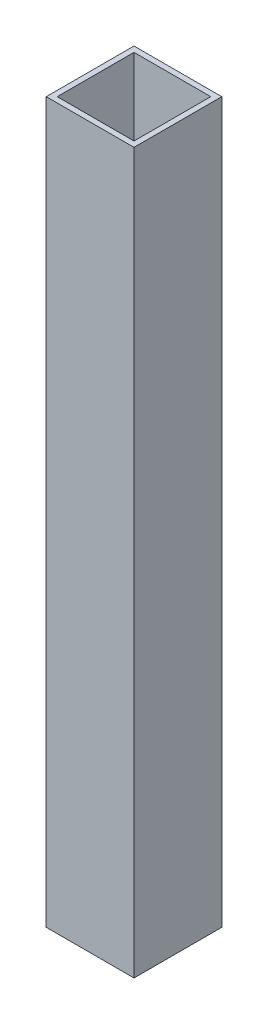
ISO-10303-21;
HEADER;
FILE_DESCRIPTION(('STEP AP214'),'2;1');
FILE_NAME('part.step','',(''),(''),'','','');
FILE_SCHEMA(('AUTOMOTIVE_DESIGN { 1 0 10303 214 1 1 1 1 }'));
ENDSEC;
DATA;
#1=APPLICATION_CONTEXT('core data for automotive mechanical design processes');
#2=APPLICATION_PROTOCOL_DEFINITION('international standard','automotive_design',2000,#1);
#3=PRODUCT_CONTEXT('',#1,'mechanical');
#4=PRODUCT('Part','Part','',(#3));
#5=PRODUCT_RELATED_PRODUCT_CATEGORY('part','',(#4));
#6=PRODUCT_DEFINITION_FORMATION('','',#4);
#7=PRODUCT_DEFINITION_CONTEXT('part definition',#1,'design');
#8=PRODUCT_DEFINITION('design','',#6,#7);
#9=PRODUCT_DEFINITION_SHAPE('','',#8);
#10=(LENGTH_UNIT() NAMED_UNIT(*) SI_UNIT(.MILLI.,.METRE.));
#11=(NAMED_UNIT(*) PLANE_ANGLE_UNIT() SI_UNIT($,.RADIAN.));
#12=(NAMED_UNIT(*) SI_UNIT($,.STERADIAN.) SOLID_ANGLE_UNIT());
#13=UNCERTAINTY_MEASURE_WITH_UNIT(LENGTH_MEASURE(1.E-05),#10,'distance_accuracy_value','');
#14=(GEOMETRIC_REPRESENTATION_CONTEXT(3) GLOBAL_UNCERTAINTY_ASSIGNED_CONTEXT((#13)) GLOBAL_UNIT_ASSIGNED_CONTEXT((#10,
#11,#12)) REPRESENTATION_CONTEXT('',''));
#15=CARTESIAN_POINT('',(0.,0.,0.));
#16=DIRECTION('',(0.,0.,1.));
#17=DIRECTION('',(1.,0.,0.));
#18=AXIS2_PLACEMENT_3D('',#15,#16,#17);
#19=CARTESIAN_POINT('',(0.,416.4076,0.));
#20=DIRECTION('',(0.,-1.,0.));
#21=DIRECTION('',(0.,0.,-1.));
#22=AXIS2_PLACEMENT_3D('',#19,#20,#21);
#23=PLANE('',#22);
#24=DIRECTION('',(0.,0.,-1.));
#25=VECTOR('',#24,1.);
#26=CARTESIAN_POINT('',(25.4,416.4076,25.4));
#27=LINE('',#26,#25);
#28=CARTESIAN_POINT('',(25.4,416.4076,25.4));
#29=VERTEX_POINT('',#28);
#30=CARTESIAN_POINT('',(25.4,416.4076,-25.4));
#31=VERTEX_POINT('',#30);
#32=EDGE_CURVE('E137',#29,#31,#27,.T.);
#33=ORIENTED_EDGE('',*,*,#32,.T.);
#34=DIRECTION('',(-1.,0.,0.));
#35=VECTOR('',#34,1.);
#36=CARTESIAN_POINT('',(-25.4,416.4076,-25.4));
#37=LINE('',#36,#35);
#38=CARTESIAN_POINT('',(-25.4,416.4076,-25.4));
#39=VERTEX_POINT('',#38);
#40=EDGE_CURVE('E143',#31,#39,#37,.T.);
#41=ORIENTED_EDGE('',*,*,#40,.T.);
#42=DIRECTION('',(0.,0.,1.));
#43=VECTOR('',#42,1.);
#44=CARTESIAN_POINT('',(-25.4,416.4076,25.4));
#45=LINE('',#44,#43);
#46=CARTESIAN_POINT('',(-25.4,416.4076,25.4));
#47=VERTEX_POINT('',#46);
#48=EDGE_CURVE('E146',#39,#47,#45,.T.);
#49=ORIENTED_EDGE('',*,*,#48,.T.);
#50=DIRECTION('',(1.,0.,0.));
#51=VECTOR('',#50,1.);
#52=CARTESIAN_POINT('',(-25.4,416.4076,25.4));
#53=LINE('',#52,#51);
#54=EDGE_CURVE('E148',#47,#29,#53,.T.);
#55=ORIENTED_EDGE('',*,*,#54,.T.);
#56=EDGE_LOOP('',(#33,#41,#49,#55));
#57=FACE_BOUND('',#56,.T.);
#58=DIRECTION('',(0.,0.,-1.));
#59=VECTOR('',#58,1.);
#60=CARTESIAN_POINT('',(22.225,416.4076,22.225));
#61=LINE('',#60,#59);
#62=CARTESIAN_POINT('',(22.225,416.4076,22.225));
#63=VERTEX_POINT('',#62);
#64=CARTESIAN_POINT('',(22.225,416.4076,-22.225));
#65=VERTEX_POINT('',#64);
#66=EDGE_CURVE('E103',#63,#65,#61,.T.);
#67=ORIENTED_EDGE('',*,*,#66,.F.);
#68=DIRECTION('',(1.,0.,0.));
#69=VECTOR('',#68,1.);
#70=CARTESIAN_POINT('',(-22.225,416.4076,22.225));
#71=LINE('',#70,#69);
#72=CARTESIAN_POINT('',(-22.225,416.4076,22.225));
#73=VERTEX_POINT('',#72);
#74=EDGE_CURVE('E127',#73,#63,#71,.T.);
#75=ORIENTED_EDGE('',*,*,#74,.F.);
#76=DIRECTION('',(0.,0.,1.));
#77=VECTOR('',#76,1.);
#78=CARTESIAN_POINT('',(-22.225,416.4076,22.225));
#79=LINE('',#78,#77);
#80=CARTESIAN_POINT('',(-22.225,416.4076,-22.225));
#81=VERTEX_POINT('',#80);
#82=EDGE_CURVE('E124',#81,#73,#79,.T.);
#83=ORIENTED_EDGE('',*,*,#82,.F.);
#84=DIRECTION('',(-1.,0.,0.));
#85=VECTOR('',#84,1.);
#86=CARTESIAN_POINT('',(-22.225,416.4076,-22.225));
#87=LINE('',#86,#85);
#88=EDGE_CURVE('E115',#65,#81,#87,.T.);
#89=ORIENTED_EDGE('',*,*,#88,.F.);
#90=EDGE_LOOP('',(#67,#75,#83,#89));
#91=FACE_BOUND('',#90,.T.);
#92=ADVANCED_FACE('F39',(#57,#91),#23,.F.);
#93=CARTESIAN_POINT('',(0.,0.,0.));
#94=DIRECTION('',(0.,-1.,0.));
#95=DIRECTION('',(0.,0.,-1.));
#96=AXIS2_PLACEMENT_3D('',#93,#94,#95);
#97=PLANE('',#96);
#98=DIRECTION('',(0.,0.,-1.));
#99=VECTOR('',#98,1.);
#100=CARTESIAN_POINT('',(25.4,0.,25.4));
#101=LINE('',#100,#99);
#102=CARTESIAN_POINT('',(25.4,0.,25.4));
#103=VERTEX_POINT('',#102);
#104=CARTESIAN_POINT('',(25.4,0.,-25.4));
#105=VERTEX_POINT('',#104);
#106=EDGE_CURVE('E119',#103,#105,#101,.T.);
#107=ORIENTED_EDGE('',*,*,#106,.F.);
#108=DIRECTION('',(1.,0.,0.));
#109=VECTOR('',#108,1.);
#110=CARTESIAN_POINT('',(-25.4,0.,25.4));
#111=LINE('',#110,#109);
#112=CARTESIAN_POINT('',(-25.4,0.,25.4));
#113=VERTEX_POINT('',#112);
#114=EDGE_CURVE('E142',#113,#103,#111,.T.);
#115=ORIENTED_EDGE('',*,*,#114,.F.);
#116=DIRECTION('',(0.,0.,1.));
#117=VECTOR('',#116,1.);
#118=CARTESIAN_POINT('',(-25.4,0.,25.4));
#119=LINE('',#118,#117);
#120=CARTESIAN_POINT('',(-25.4,0.,-25.4));
#121=VERTEX_POINT('',#120);
#122=EDGE_CURVE('E154',#121,#113,#119,.T.);
#123=ORIENTED_EDGE('',*,*,#122,.F.);
#124=DIRECTION('',(-1.,0.,0.));
#125=VECTOR('',#124,1.);
#126=CARTESIAN_POINT('',(-25.4,0.,-25.4));
#127=LINE('',#126,#125);
#128=EDGE_CURVE('E152',#105,#121,#127,.T.);
#129=ORIENTED_EDGE('',*,*,#128,.F.);
#130=EDGE_LOOP('',(#107,#115,#123,#129));
#131=FACE_BOUND('',#130,.T.);
#132=DIRECTION('',(1.,0.,0.));
#133=VECTOR('',#132,1.);
#134=CARTESIAN_POINT('',(-22.225,0.,22.225));
#135=LINE('',#134,#133);
#136=CARTESIAN_POINT('',(-22.225,0.,22.225));
#137=VERTEX_POINT('',#136);
#138=CARTESIAN_POINT('',(22.225,0.,22.225));
#139=VERTEX_POINT('',#138);
#140=EDGE_CURVE('E114',#137,#139,#135,.T.);
#141=ORIENTED_EDGE('',*,*,#140,.T.);
#142=DIRECTION('',(0.,0.,-1.));
#143=VECTOR('',#142,1.);
#144=CARTESIAN_POINT('',(22.225,0.,22.225));
#145=LINE('',#144,#143);
#146=CARTESIAN_POINT('',(22.225,0.,-22.225));
#147=VERTEX_POINT('',#146);
#148=EDGE_CURVE('E65',#139,#147,#145,.T.);
#149=ORIENTED_EDGE('',*,*,#148,.T.);
#150=DIRECTION('',(-1.,0.,0.));
#151=VECTOR('',#150,1.);
#152=CARTESIAN_POINT('',(-22.225,0.,-22.225));
#153=LINE('',#152,#151);
#154=CARTESIAN_POINT('',(-22.225,0.,-22.225));
#155=VERTEX_POINT('',#154);
#156=EDGE_CURVE('E117',#147,#155,#153,.T.);
#157=ORIENTED_EDGE('',*,*,#156,.T.);
#158=DIRECTION('',(0.,0.,1.));
#159=VECTOR('',#158,1.);
#160=CARTESIAN_POINT('',(-22.225,0.,22.225));
#161=LINE('',#160,#159);
#162=EDGE_CURVE('E132',#155,#137,#161,.T.);
#163=ORIENTED_EDGE('',*,*,#162,.T.);
#164=EDGE_LOOP('',(#141,#149,#157,#163));
#165=FACE_BOUND('',#164,.T.);
#166=ADVANCED_FACE('F171',(#131,#165),#97,.T.);
#167=CARTESIAN_POINT('',(25.4,416.4076,25.4));
#168=DIRECTION('',(-1.,0.,0.));
#169=DIRECTION('',(0.,0.,1.));
#170=AXIS2_PLACEMENT_3D('',#167,#168,#169);
#171=PLANE('',#170);
#172=ORIENTED_EDGE('',*,*,#106,.T.);
#173=DIRECTION('',(0.,-1.,0.));
#174=VECTOR('',#173,1.);
#175=CARTESIAN_POINT('',(25.4,416.4076,-25.4));
#176=LINE('',#175,#174);
#177=EDGE_CURVE('E11',#31,#105,#176,.T.);
#178=ORIENTED_EDGE('',*,*,#177,.F.);
#179=ORIENTED_EDGE('',*,*,#32,.F.);
#180=DIRECTION('',(0.,-1.,0.));
#181=VECTOR('',#180,1.);
#182=CARTESIAN_POINT('',(25.4,416.4076,25.4));
#183=LINE('',#182,#181);
#184=EDGE_CURVE('E149',#29,#103,#183,.T.);
#185=ORIENTED_EDGE('',*,*,#184,.T.);
#186=EDGE_LOOP('',(#172,#178,#179,#185));
#187=FACE_BOUND('',#186,.T.);
#188=ADVANCED_FACE('F41',(#187),#171,.F.);
#189=CARTESIAN_POINT('',(-25.4,416.4076,-25.4));
#190=DIRECTION('',(0.,0.,1.));
#191=DIRECTION('',(1.,0.,0.));
#192=AXIS2_PLACEMENT_3D('',#189,#190,#191);
#193=PLANE('',#192);
#194=ORIENTED_EDGE('',*,*,#128,.T.);
#195=DIRECTION('',(0.,-1.,0.));
#196=VECTOR('',#195,1.);
#197=CARTESIAN_POINT('',(-25.4,416.4076,-25.4));
#198=LINE('',#197,#196);
#199=EDGE_CURVE('E50',#39,#121,#198,.T.);
#200=ORIENTED_EDGE('',*,*,#199,.F.);
#201=ORIENTED_EDGE('',*,*,#40,.F.);
#202=ORIENTED_EDGE('',*,*,#177,.T.);
#203=EDGE_LOOP('',(#194,#200,#201,#202));
#204=FACE_BOUND('',#203,.T.);
#205=ADVANCED_FACE('F181',(#204),#193,.F.);
#206=CARTESIAN_POINT('',(-25.4,416.4076,25.4));
#207=DIRECTION('',(1.,0.,0.));
#208=DIRECTION('',(0.,0.,-1.));
#209=AXIS2_PLACEMENT_3D('',#206,#207,#208);
#210=PLANE('',#209);
#211=ORIENTED_EDGE('',*,*,#122,.T.);
#212=DIRECTION('',(0.,-1.,0.));
#213=VECTOR('',#212,1.);
#214=CARTESIAN_POINT('',(-25.4,416.4076,25.4));
#215=LINE('',#214,#213);
#216=EDGE_CURVE('E158',#47,#113,#215,.T.);
#217=ORIENTED_EDGE('',*,*,#216,.F.);
#218=ORIENTED_EDGE('',*,*,#48,.F.);
#219=ORIENTED_EDGE('',*,*,#199,.T.);
#220=EDGE_LOOP('',(#211,#217,#218,#219));
#221=FACE_BOUND('',#220,.T.);
#222=ADVANCED_FACE('F170',(#221),#210,.F.);
#223=CARTESIAN_POINT('',(-25.4,416.4076,25.4));
#224=DIRECTION('',(0.,0.,-1.));
#225=DIRECTION('',(-1.,0.,0.));
#226=AXIS2_PLACEMENT_3D('',#223,#224,#225);
#227=PLANE('',#226);
#228=ORIENTED_EDGE('',*,*,#114,.T.);
#229=ORIENTED_EDGE('',*,*,#184,.F.);
#230=ORIENTED_EDGE('',*,*,#54,.F.);
#231=ORIENTED_EDGE('',*,*,#216,.T.);
#232=EDGE_LOOP('',(#228,#229,#230,#231));
#233=FACE_BOUND('',#232,.T.);
#234=ADVANCED_FACE('F180',(#233),#227,.F.);
#235=CARTESIAN_POINT('',(22.225,416.4076,22.225));
#236=DIRECTION('',(-1.,0.,0.));
#237=DIRECTION('',(0.,0.,1.));
#238=AXIS2_PLACEMENT_3D('',#235,#236,#237);
#239=PLANE('',#238);
#240=ORIENTED_EDGE('',*,*,#148,.F.);
#241=DIRECTION('',(0.,-1.,0.));
#242=VECTOR('',#241,1.);
#243=CARTESIAN_POINT('',(22.225,416.4076,22.225));
#244=LINE('',#243,#242);
#245=EDGE_CURVE('E109',#63,#139,#244,.T.);
#246=ORIENTED_EDGE('',*,*,#245,.F.);
#247=ORIENTED_EDGE('',*,*,#66,.T.);
#248=DIRECTION('',(0.,-1.,0.));
#249=VECTOR('',#248,1.);
#250=CARTESIAN_POINT('',(22.225,416.4076,-22.225));
#251=LINE('',#250,#249);
#252=EDGE_CURVE('E110',#65,#147,#251,.T.);
#253=ORIENTED_EDGE('',*,*,#252,.T.);
#254=EDGE_LOOP('',(#240,#246,#247,#253));
#255=FACE_BOUND('',#254,.T.);
#256=ADVANCED_FACE('F107',(#255),#239,.T.);
#257=CARTESIAN_POINT('',(-22.225,416.4076,-22.225));
#258=DIRECTION('',(0.,0.,1.));
#259=DIRECTION('',(1.,0.,0.));
#260=AXIS2_PLACEMENT_3D('',#257,#258,#259);
#261=PLANE('',#260);
#262=ORIENTED_EDGE('',*,*,#156,.F.);
#263=ORIENTED_EDGE('',*,*,#252,.F.);
#264=ORIENTED_EDGE('',*,*,#88,.T.);
#265=DIRECTION('',(0.,-1.,0.));
#266=VECTOR('',#265,1.);
#267=CARTESIAN_POINT('',(-22.225,416.4076,-22.225));
#268=LINE('',#267,#266);
#269=EDGE_CURVE('E122',#81,#155,#268,.T.);
#270=ORIENTED_EDGE('',*,*,#269,.T.);
#271=EDGE_LOOP('',(#262,#263,#264,#270));
#272=FACE_BOUND('',#271,.T.);
#273=ADVANCED_FACE('F116',(#272),#261,.T.);
#274=CARTESIAN_POINT('',(-22.225,416.4076,22.225));
#275=DIRECTION('',(1.,0.,0.));
#276=DIRECTION('',(0.,0.,-1.));
#277=AXIS2_PLACEMENT_3D('',#274,#275,#276);
#278=PLANE('',#277);
#279=ORIENTED_EDGE('',*,*,#162,.F.);
#280=ORIENTED_EDGE('',*,*,#269,.F.);
#281=ORIENTED_EDGE('',*,*,#82,.T.);
#282=DIRECTION('',(0.,-1.,0.));
#283=VECTOR('',#282,1.);
#284=CARTESIAN_POINT('',(-22.225,416.4076,22.225));
#285=LINE('',#284,#283);
#286=EDGE_CURVE('E53',#73,#137,#285,.T.);
#287=ORIENTED_EDGE('',*,*,#286,.T.);
#288=EDGE_LOOP('',(#279,#280,#281,#287));
#289=FACE_BOUND('',#288,.T.);
#290=ADVANCED_FACE('F207',(#289),#278,.T.);
#291=CARTESIAN_POINT('',(-22.225,416.4076,22.225));
#292=DIRECTION('',(0.,0.,-1.));
#293=DIRECTION('',(-1.,0.,0.));
#294=AXIS2_PLACEMENT_3D('',#291,#292,#293);
#295=PLANE('',#294);
#296=ORIENTED_EDGE('',*,*,#140,.F.);
#297=ORIENTED_EDGE('',*,*,#286,.F.);
#298=ORIENTED_EDGE('',*,*,#74,.T.);
#299=ORIENTED_EDGE('',*,*,#245,.T.);
#300=EDGE_LOOP('',(#296,#297,#298,#299));
#301=FACE_BOUND('',#300,.T.);
#302=ADVANCED_FACE('F208',(#301),#295,.T.);
#303=CLOSED_SHELL('',(#92,#166,#188,#205,#222,#234,#256,#273,#290,#302));
#304=MANIFOLD_SOLID_BREP('B2',#303);
#305=ADVANCED_BREP_SHAPE_REPRESENTATION('',(#18,#304),#14);
#306=SHAPE_DEFINITION_REPRESENTATION(#9,#305);
ENDSEC;
END-ISO-10303-21;
